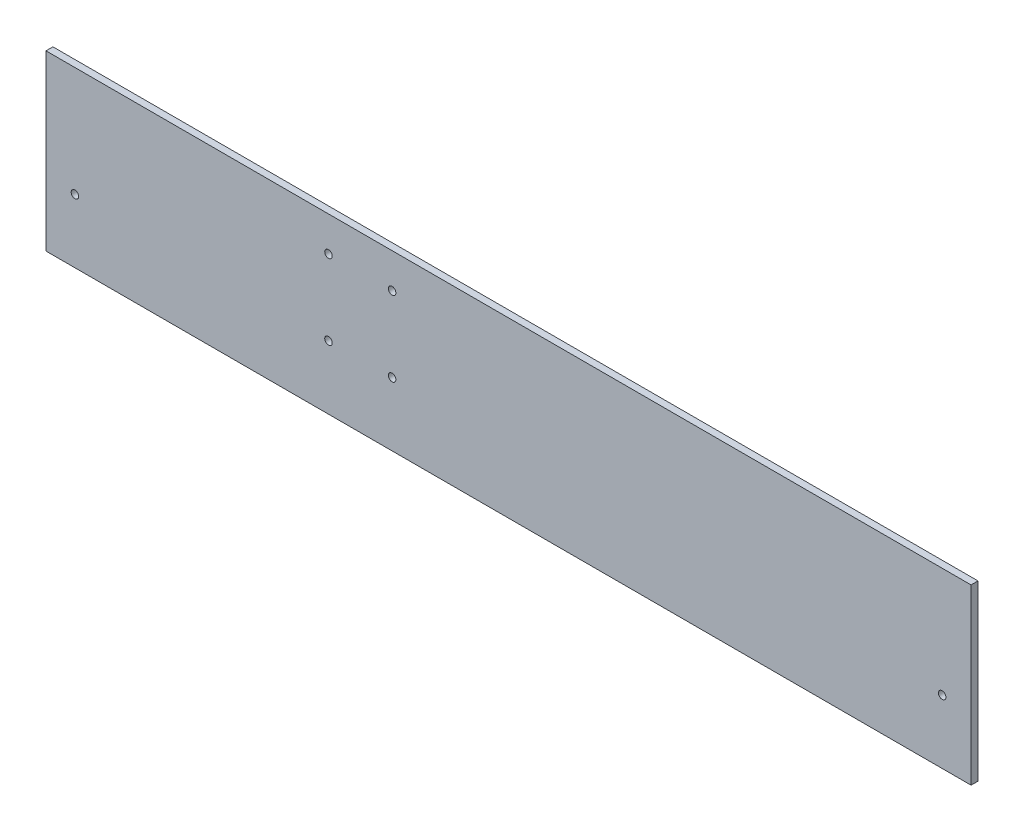
ISO-10303-21;
HEADER;
FILE_DESCRIPTION(('STEP AP214'),'2;1');
FILE_NAME('part.step','',(''),(''),'','','');
FILE_SCHEMA(('AUTOMOTIVE_DESIGN { 1 0 10303 214 1 1 1 1 }'));
ENDSEC;
DATA;
#1=APPLICATION_CONTEXT('core data for automotive mechanical design processes');
#2=APPLICATION_PROTOCOL_DEFINITION('international standard','automotive_design',2000,#1);
#3=PRODUCT_CONTEXT('',#1,'mechanical');
#4=PRODUCT('Part','Part','',(#3));
#5=PRODUCT_RELATED_PRODUCT_CATEGORY('part','',(#4));
#6=PRODUCT_DEFINITION_FORMATION('','',#4);
#7=PRODUCT_DEFINITION_CONTEXT('part definition',#1,'design');
#8=PRODUCT_DEFINITION('design','',#6,#7);
#9=PRODUCT_DEFINITION_SHAPE('','',#8);
#10=(LENGTH_UNIT() NAMED_UNIT(*) SI_UNIT(.MILLI.,.METRE.));
#11=(NAMED_UNIT(*) PLANE_ANGLE_UNIT() SI_UNIT($,.RADIAN.));
#12=(NAMED_UNIT(*) SI_UNIT($,.STERADIAN.) SOLID_ANGLE_UNIT());
#13=UNCERTAINTY_MEASURE_WITH_UNIT(LENGTH_MEASURE(1.E-05),#10,'distance_accuracy_value','');
#14=(GEOMETRIC_REPRESENTATION_CONTEXT(3) GLOBAL_UNCERTAINTY_ASSIGNED_CONTEXT((#13)) GLOBAL_UNIT_ASSIGNED_CONTEXT((#10,
#11,#12)) REPRESENTATION_CONTEXT('',''));
#15=CARTESIAN_POINT('',(0.,0.,0.));
#16=DIRECTION('',(0.,0.,1.));
#17=DIRECTION('',(1.,0.,0.));
#18=AXIS2_PLACEMENT_3D('',#15,#16,#17);
#19=CARTESIAN_POINT('',(400.,-75.,-6.));
#20=DIRECTION('',(1.,0.,0.));
#21=DIRECTION('',(0.,0.,-1.));
#22=AXIS2_PLACEMENT_3D('',#19,#20,#21);
#23=PLANE('',#22);
#24=DIRECTION('',(0.,1.,0.));
#25=VECTOR('',#24,1.);
#26=CARTESIAN_POINT('',(400.,-75.,0.));
#27=LINE('',#26,#25);
#28=CARTESIAN_POINT('',(400.,-75.,0.));
#29=VERTEX_POINT('',#28);
#30=CARTESIAN_POINT('',(400.,75.,0.));
#31=VERTEX_POINT('',#30);
#32=EDGE_CURVE('E101',#29,#31,#27,.T.);
#33=ORIENTED_EDGE('',*,*,#32,.F.);
#34=DIRECTION('',(0.,0.,1.));
#35=VECTOR('',#34,1.);
#36=CARTESIAN_POINT('',(400.,-75.,-6.));
#37=LINE('',#36,#35);
#38=CARTESIAN_POINT('',(400.,-75.,-6.));
#39=VERTEX_POINT('',#38);
#40=EDGE_CURVE('E11',#39,#29,#37,.T.);
#41=ORIENTED_EDGE('',*,*,#40,.F.);
#42=DIRECTION('',(0.,1.,0.));
#43=VECTOR('',#42,1.);
#44=CARTESIAN_POINT('',(400.,-75.,-6.));
#45=LINE('',#44,#43);
#46=CARTESIAN_POINT('',(400.,75.,-6.));
#47=VERTEX_POINT('',#46);
#48=EDGE_CURVE('E94',#39,#47,#45,.T.);
#49=ORIENTED_EDGE('',*,*,#48,.T.);
#50=DIRECTION('',(0.,0.,1.));
#51=VECTOR('',#50,1.);
#52=CARTESIAN_POINT('',(400.,75.,-6.));
#53=LINE('',#52,#51);
#54=EDGE_CURVE('E39',#47,#31,#53,.T.);
#55=ORIENTED_EDGE('',*,*,#54,.T.);
#56=EDGE_LOOP('',(#33,#41,#49,#55));
#57=FACE_BOUND('',#56,.T.);
#58=ADVANCED_FACE('F36',(#57),#23,.T.);
#59=CARTESIAN_POINT('',(-400.,-75.,-6.));
#60=DIRECTION('',(0.,-1.,0.));
#61=DIRECTION('',(0.,0.,-1.));
#62=AXIS2_PLACEMENT_3D('',#59,#60,#61);
#63=PLANE('',#62);
#64=DIRECTION('',(1.,0.,0.));
#65=VECTOR('',#64,1.);
#66=CARTESIAN_POINT('',(-400.,-75.,0.));
#67=LINE('',#66,#65);
#68=CARTESIAN_POINT('',(-400.,-75.,0.));
#69=VERTEX_POINT('',#68);
#70=EDGE_CURVE('E96',#69,#29,#67,.T.);
#71=ORIENTED_EDGE('',*,*,#70,.F.);
#72=DIRECTION('',(0.,0.,1.));
#73=VECTOR('',#72,1.);
#74=CARTESIAN_POINT('',(-400.,-75.,-6.));
#75=LINE('',#74,#73);
#76=CARTESIAN_POINT('',(-400.,-75.,-6.));
#77=VERTEX_POINT('',#76);
#78=EDGE_CURVE('E45',#77,#69,#75,.T.);
#79=ORIENTED_EDGE('',*,*,#78,.F.);
#80=DIRECTION('',(1.,0.,0.));
#81=VECTOR('',#80,1.);
#82=CARTESIAN_POINT('',(-400.,-75.,-6.));
#83=LINE('',#82,#81);
#84=EDGE_CURVE('E91',#77,#39,#83,.T.);
#85=ORIENTED_EDGE('',*,*,#84,.T.);
#86=ORIENTED_EDGE('',*,*,#40,.T.);
#87=EDGE_LOOP('',(#71,#79,#85,#86));
#88=FACE_BOUND('',#87,.T.);
#89=ADVANCED_FACE('F112',(#88),#63,.T.);
#90=CARTESIAN_POINT('',(-400.,-75.,-6.));
#91=DIRECTION('',(-1.,0.,0.));
#92=DIRECTION('',(0.,0.,1.));
#93=AXIS2_PLACEMENT_3D('',#90,#91,#92);
#94=PLANE('',#93);
#95=DIRECTION('',(0.,-1.,0.));
#96=VECTOR('',#95,1.);
#97=CARTESIAN_POINT('',(-400.,-75.,0.));
#98=LINE('',#97,#96);
#99=CARTESIAN_POINT('',(-400.,75.,0.));
#100=VERTEX_POINT('',#99);
#101=EDGE_CURVE('E86',#100,#69,#98,.T.);
#102=ORIENTED_EDGE('',*,*,#101,.F.);
#103=DIRECTION('',(0.,0.,1.));
#104=VECTOR('',#103,1.);
#105=CARTESIAN_POINT('',(-400.,75.,-6.));
#106=LINE('',#105,#104);
#107=CARTESIAN_POINT('',(-400.,75.,-6.));
#108=VERTEX_POINT('',#107);
#109=EDGE_CURVE('E81',#108,#100,#106,.T.);
#110=ORIENTED_EDGE('',*,*,#109,.F.);
#111=DIRECTION('',(0.,-1.,0.));
#112=VECTOR('',#111,1.);
#113=CARTESIAN_POINT('',(-400.,-75.,-6.));
#114=LINE('',#113,#112);
#115=EDGE_CURVE('E84',#108,#77,#114,.T.);
#116=ORIENTED_EDGE('',*,*,#115,.T.);
#117=ORIENTED_EDGE('',*,*,#78,.T.);
#118=EDGE_LOOP('',(#102,#110,#116,#117));
#119=FACE_BOUND('',#118,.T.);
#120=ADVANCED_FACE('F83',(#119),#94,.T.);
#121=CARTESIAN_POINT('',(-400.,75.,-6.));
#122=DIRECTION('',(0.,1.,0.));
#123=DIRECTION('',(0.,0.,1.));
#124=AXIS2_PLACEMENT_3D('',#121,#122,#123);
#125=PLANE('',#124);
#126=DIRECTION('',(-1.,0.,0.));
#127=VECTOR('',#126,1.);
#128=CARTESIAN_POINT('',(-400.,75.,0.));
#129=LINE('',#128,#127);
#130=EDGE_CURVE('E104',#31,#100,#129,.T.);
#131=ORIENTED_EDGE('',*,*,#130,.F.);
#132=ORIENTED_EDGE('',*,*,#54,.F.);
#133=DIRECTION('',(-1.,0.,0.));
#134=VECTOR('',#133,1.);
#135=CARTESIAN_POINT('',(-400.,75.,-6.));
#136=LINE('',#135,#134);
#137=EDGE_CURVE('E90',#47,#108,#136,.T.);
#138=ORIENTED_EDGE('',*,*,#137,.T.);
#139=ORIENTED_EDGE('',*,*,#109,.T.);
#140=EDGE_LOOP('',(#131,#132,#138,#139));
#141=FACE_BOUND('',#140,.T.);
#142=ADVANCED_FACE('F93',(#141),#125,.T.);
#143=CARTESIAN_POINT('',(0.,0.,-6.));
#144=DIRECTION('',(0.,0.,-1.));
#145=DIRECTION('',(-1.,0.,0.));
#146=AXIS2_PLACEMENT_3D('',#143,#144,#145);
#147=PLANE('',#146);
#148=CARTESIAN_POINT('',(-155.7,45.,-6.));
#149=DIRECTION('',(0.,0.,1.));
#150=DIRECTION('',(1.,0.,0.));
#151=AXIS2_PLACEMENT_3D('',#148,#149,#150);
#152=CIRCLE('',#151,3.25000000000001);
#153=CARTESIAN_POINT('',(-152.45,45.,-6.));
#154=VERTEX_POINT('',#153);
#155=EDGE_CURVE('E171',#154,#154,#152,.T.);
#156=ORIENTED_EDGE('',*,*,#155,.T.);
#157=EDGE_LOOP('',(#156));
#158=FACE_BOUND('',#157,.T.);
#159=CARTESIAN_POINT('',(-100.7,-20.,-6.));
#160=DIRECTION('',(0.,0.,1.));
#161=DIRECTION('',(1.,0.,0.));
#162=AXIS2_PLACEMENT_3D('',#159,#160,#161);
#163=CIRCLE('',#162,3.25000000000001);
#164=CARTESIAN_POINT('',(-97.45,-20.,-6.));
#165=VERTEX_POINT('',#164);
#166=EDGE_CURVE('E177',#165,#165,#163,.T.);
#167=ORIENTED_EDGE('',*,*,#166,.T.);
#168=EDGE_LOOP('',(#167));
#169=FACE_BOUND('',#168,.T.);
#170=CARTESIAN_POINT('',(-155.7,-20.,-6.));
#171=DIRECTION('',(0.,0.,1.));
#172=DIRECTION('',(1.,0.,0.));
#173=AXIS2_PLACEMENT_3D('',#170,#171,#172);
#174=CIRCLE('',#173,3.25000000000001);
#175=CARTESIAN_POINT('',(-152.45,-20.,-6.));
#176=VERTEX_POINT('',#175);
#177=EDGE_CURVE('E162',#176,#176,#174,.T.);
#178=ORIENTED_EDGE('',*,*,#177,.T.);
#179=EDGE_LOOP('',(#178));
#180=FACE_BOUND('',#179,.T.);
#181=CARTESIAN_POINT('',(-100.7,45.,-6.));
#182=DIRECTION('',(0.,0.,1.));
#183=DIRECTION('',(1.,0.,0.));
#184=AXIS2_PLACEMENT_3D('',#181,#182,#183);
#185=CIRCLE('',#184,3.25000000000001);
#186=CARTESIAN_POINT('',(-97.45,45.,-6.));
#187=VERTEX_POINT('',#186);
#188=EDGE_CURVE('E182',#187,#187,#185,.T.);
#189=ORIENTED_EDGE('',*,*,#188,.T.);
#190=EDGE_LOOP('',(#189));
#191=FACE_BOUND('',#190,.T.);
#192=CARTESIAN_POINT('',(-375.,-20.0000000000001,-6.));
#193=DIRECTION('',(0.,0.,-1.));
#194=DIRECTION('',(-1.,0.,0.));
#195=AXIS2_PLACEMENT_3D('',#192,#193,#194);
#196=CIRCLE('',#195,3.24999999999995);
#197=CARTESIAN_POINT('',(-378.25,-20.0000000000001,-6.));
#198=VERTEX_POINT('',#197);
#199=EDGE_CURVE('E105',#198,#198,#196,.T.);
#200=ORIENTED_EDGE('',*,*,#199,.F.);
#201=EDGE_LOOP('',(#200));
#202=FACE_BOUND('',#201,.T.);
#203=CARTESIAN_POINT('',(375.,-20.,-6.));
#204=DIRECTION('',(0.,0.,-1.));
#205=DIRECTION('',(-1.,0.,0.));
#206=AXIS2_PLACEMENT_3D('',#203,#204,#205);
#207=CIRCLE('',#206,3.24999999999995);
#208=CARTESIAN_POINT('',(371.75,-20.,-6.));
#209=VERTEX_POINT('',#208);
#210=EDGE_CURVE('E191',#209,#209,#207,.T.);
#211=ORIENTED_EDGE('',*,*,#210,.F.);
#212=EDGE_LOOP('',(#211));
#213=FACE_BOUND('',#212,.T.);
#214=ORIENTED_EDGE('',*,*,#48,.F.);
#215=ORIENTED_EDGE('',*,*,#84,.F.);
#216=ORIENTED_EDGE('',*,*,#115,.F.);
#217=ORIENTED_EDGE('',*,*,#137,.F.);
#218=EDGE_LOOP('',(#214,#215,#216,#217));
#219=FACE_BOUND('',#218,.T.);
#220=ADVANCED_FACE('F89',(#158,#169,#180,#191,#202,#213,#219),#147,.T.);
#221=CARTESIAN_POINT('',(0.,0.,0.));
#222=DIRECTION('',(0.,0.,-1.));
#223=DIRECTION('',(-1.,0.,0.));
#224=AXIS2_PLACEMENT_3D('',#221,#222,#223);
#225=PLANE('',#224);
#226=CARTESIAN_POINT('',(-155.7,45.,0.));
#227=DIRECTION('',(0.,0.,1.));
#228=DIRECTION('',(1.,0.,0.));
#229=AXIS2_PLACEMENT_3D('',#226,#227,#228);
#230=CIRCLE('',#229,3.25000000000001);
#231=CARTESIAN_POINT('',(-152.45,45.,0.));
#232=VERTEX_POINT('',#231);
#233=EDGE_CURVE('E174',#232,#232,#230,.T.);
#234=ORIENTED_EDGE('',*,*,#233,.F.);
#235=EDGE_LOOP('',(#234));
#236=FACE_BOUND('',#235,.T.);
#237=CARTESIAN_POINT('',(-100.7,-20.,0.));
#238=DIRECTION('',(0.,0.,1.));
#239=DIRECTION('',(1.,0.,0.));
#240=AXIS2_PLACEMENT_3D('',#237,#238,#239);
#241=CIRCLE('',#240,3.25000000000001);
#242=CARTESIAN_POINT('',(-97.45,-20.,0.));
#243=VERTEX_POINT('',#242);
#244=EDGE_CURVE('E168',#243,#243,#241,.T.);
#245=ORIENTED_EDGE('',*,*,#244,.F.);
#246=EDGE_LOOP('',(#245));
#247=FACE_BOUND('',#246,.T.);
#248=CARTESIAN_POINT('',(-155.7,-20.,0.));
#249=DIRECTION('',(0.,0.,1.));
#250=DIRECTION('',(1.,0.,0.));
#251=AXIS2_PLACEMENT_3D('',#248,#249,#250);
#252=CIRCLE('',#251,3.25000000000001);
#253=CARTESIAN_POINT('',(-152.45,-20.,0.));
#254=VERTEX_POINT('',#253);
#255=EDGE_CURVE('E165',#254,#254,#252,.T.);
#256=ORIENTED_EDGE('',*,*,#255,.F.);
#257=EDGE_LOOP('',(#256));
#258=FACE_BOUND('',#257,.T.);
#259=CARTESIAN_POINT('',(-100.7,45.,0.));
#260=DIRECTION('',(0.,0.,1.));
#261=DIRECTION('',(1.,0.,0.));
#262=AXIS2_PLACEMENT_3D('',#259,#260,#261);
#263=CIRCLE('',#262,3.25000000000001);
#264=CARTESIAN_POINT('',(-97.45,45.,0.));
#265=VERTEX_POINT('',#264);
#266=EDGE_CURVE('E173',#265,#265,#263,.T.);
#267=ORIENTED_EDGE('',*,*,#266,.F.);
#268=EDGE_LOOP('',(#267));
#269=FACE_BOUND('',#268,.T.);
#270=CARTESIAN_POINT('',(-375.,-20.0000000000001,0.));
#271=DIRECTION('',(0.,0.,1.));
#272=DIRECTION('',(1.,0.,0.));
#273=AXIS2_PLACEMENT_3D('',#270,#271,#272);
#274=CIRCLE('',#273,3.24999999999995);
#275=CARTESIAN_POINT('',(-371.75,-20.0000000000001,0.));
#276=VERTEX_POINT('',#275);
#277=EDGE_CURVE('E188',#276,#276,#274,.T.);
#278=ORIENTED_EDGE('',*,*,#277,.F.);
#279=EDGE_LOOP('',(#278));
#280=FACE_BOUND('',#279,.T.);
#281=CARTESIAN_POINT('',(375.,-20.,0.));
#282=DIRECTION('',(0.,0.,1.));
#283=DIRECTION('',(1.,0.,0.));
#284=AXIS2_PLACEMENT_3D('',#281,#282,#283);
#285=CIRCLE('',#284,3.24999999999995);
#286=CARTESIAN_POINT('',(378.25,-20.,0.));
#287=VERTEX_POINT('',#286);
#288=EDGE_CURVE('E185',#287,#287,#285,.T.);
#289=ORIENTED_EDGE('',*,*,#288,.F.);
#290=EDGE_LOOP('',(#289));
#291=FACE_BOUND('',#290,.T.);
#292=ORIENTED_EDGE('',*,*,#32,.T.);
#293=ORIENTED_EDGE('',*,*,#130,.T.);
#294=ORIENTED_EDGE('',*,*,#101,.T.);
#295=ORIENTED_EDGE('',*,*,#70,.T.);
#296=EDGE_LOOP('',(#292,#293,#294,#295));
#297=FACE_BOUND('',#296,.T.);
#298=ADVANCED_FACE('F111',(#236,#247,#258,#269,#280,#291,#297),#225,.F.);
#299=CARTESIAN_POINT('',(375.,-20.,-10.));
#300=DIRECTION('',(0.,0.,1.));
#301=DIRECTION('',(1.,0.,0.));
#302=AXIS2_PLACEMENT_3D('',#299,#300,#301);
#303=CYLINDRICAL_SURFACE('',#302,3.24999999999995);
#304=ORIENTED_EDGE('',*,*,#210,.T.);
#305=EDGE_LOOP('',(#304));
#306=FACE_BOUND('',#305,.T.);
#307=ORIENTED_EDGE('',*,*,#288,.T.);
#308=EDGE_LOOP('',(#307));
#309=FACE_BOUND('',#308,.T.);
#310=ADVANCED_FACE('F130',(#306,#309),#303,.F.);
#311=CARTESIAN_POINT('',(-375.,-20.0000000000001,-10.));
#312=DIRECTION('',(0.,0.,1.));
#313=DIRECTION('',(1.,0.,0.));
#314=AXIS2_PLACEMENT_3D('',#311,#312,#313);
#315=CYLINDRICAL_SURFACE('',#314,3.24999999999995);
#316=ORIENTED_EDGE('',*,*,#199,.T.);
#317=EDGE_LOOP('',(#316));
#318=FACE_BOUND('',#317,.T.);
#319=ORIENTED_EDGE('',*,*,#277,.T.);
#320=EDGE_LOOP('',(#319));
#321=FACE_BOUND('',#320,.T.);
#322=ADVANCED_FACE('F137',(#318,#321),#315,.F.);
#323=CARTESIAN_POINT('',(-100.7,45.,-6.));
#324=DIRECTION('',(0.,0.,1.));
#325=DIRECTION('',(1.,0.,0.));
#326=AXIS2_PLACEMENT_3D('',#323,#324,#325);
#327=CYLINDRICAL_SURFACE('',#326,3.25000000000001);
#328=ORIENTED_EDGE('',*,*,#188,.F.);
#329=EDGE_LOOP('',(#328));
#330=FACE_BOUND('',#329,.T.);
#331=ORIENTED_EDGE('',*,*,#266,.T.);
#332=EDGE_LOOP('',(#331));
#333=FACE_BOUND('',#332,.T.);
#334=ADVANCED_FACE('F141',(#330,#333),#327,.F.);
#335=CARTESIAN_POINT('',(-155.7,-20.,-6.));
#336=DIRECTION('',(0.,0.,1.));
#337=DIRECTION('',(1.,0.,0.));
#338=AXIS2_PLACEMENT_3D('',#335,#336,#337);
#339=CYLINDRICAL_SURFACE('',#338,3.25000000000001);
#340=ORIENTED_EDGE('',*,*,#177,.F.);
#341=EDGE_LOOP('',(#340));
#342=FACE_BOUND('',#341,.T.);
#343=ORIENTED_EDGE('',*,*,#255,.T.);
#344=EDGE_LOOP('',(#343));
#345=FACE_BOUND('',#344,.T.);
#346=ADVANCED_FACE('F145',(#342,#345),#339,.F.);
#347=CARTESIAN_POINT('',(-100.7,-20.,-6.));
#348=DIRECTION('',(0.,0.,1.));
#349=DIRECTION('',(1.,0.,0.));
#350=AXIS2_PLACEMENT_3D('',#347,#348,#349);
#351=CYLINDRICAL_SURFACE('',#350,3.25000000000001);
#352=ORIENTED_EDGE('',*,*,#166,.F.);
#353=EDGE_LOOP('',(#352));
#354=FACE_BOUND('',#353,.T.);
#355=ORIENTED_EDGE('',*,*,#244,.T.);
#356=EDGE_LOOP('',(#355));
#357=FACE_BOUND('',#356,.T.);
#358=ADVANCED_FACE('F147',(#354,#357),#351,.F.);
#359=CARTESIAN_POINT('',(-155.7,45.,-6.));
#360=DIRECTION('',(0.,0.,1.));
#361=DIRECTION('',(1.,0.,0.));
#362=AXIS2_PLACEMENT_3D('',#359,#360,#361);
#363=CYLINDRICAL_SURFACE('',#362,3.25000000000001);
#364=ORIENTED_EDGE('',*,*,#155,.F.);
#365=EDGE_LOOP('',(#364));
#366=FACE_BOUND('',#365,.T.);
#367=ORIENTED_EDGE('',*,*,#233,.T.);
#368=EDGE_LOOP('',(#367));
#369=FACE_BOUND('',#368,.T.);
#370=ADVANCED_FACE('F150',(#366,#369),#363,.F.);
#371=CLOSED_SHELL('',(#58,#89,#120,#142,#220,#298,#310,#322,#334,#346,#358,#370));
#372=MANIFOLD_SOLID_BREP('B2',#371);
#373=ADVANCED_BREP_SHAPE_REPRESENTATION('',(#18,#372),#14);
#374=SHAPE_DEFINITION_REPRESENTATION(#9,#373);
ENDSEC;
END-ISO-10303-21;
